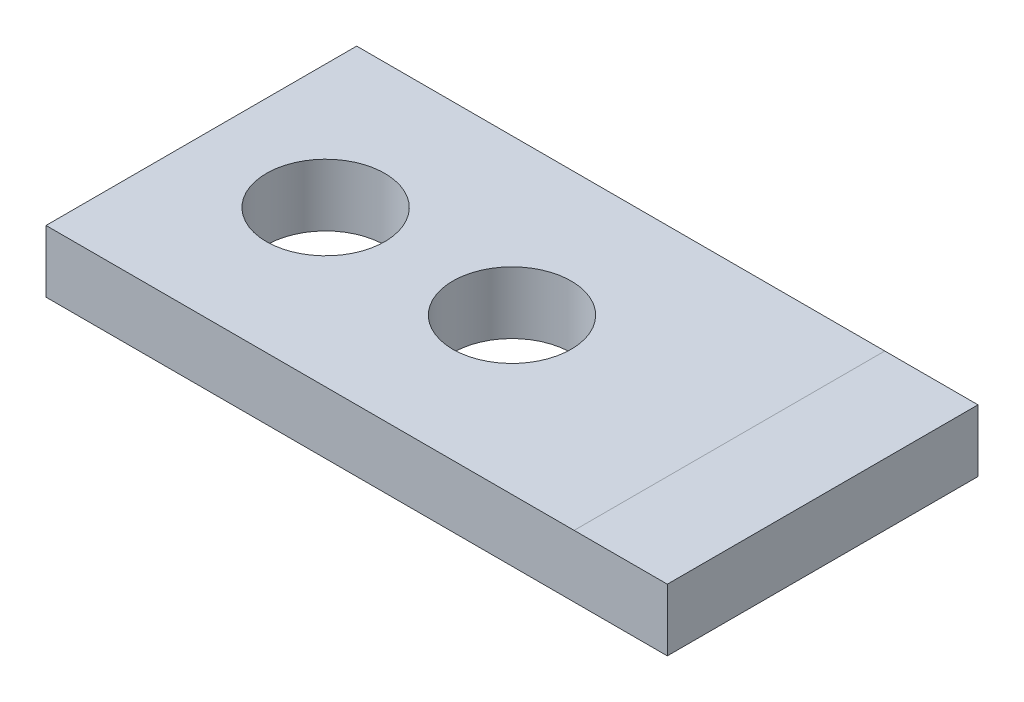
ISO-10303-21;
HEADER;
FILE_DESCRIPTION(('STEP AP214'),'2;1');
FILE_NAME('part.step','',(''),(''),'','','');
FILE_SCHEMA(('AUTOMOTIVE_DESIGN { 1 0 10303 214 1 1 1 1 }'));
ENDSEC;
DATA;
#1=APPLICATION_CONTEXT('core data for automotive mechanical design processes');
#2=APPLICATION_PROTOCOL_DEFINITION('international standard','automotive_design',2000,#1);
#3=PRODUCT_CONTEXT('',#1,'mechanical');
#4=PRODUCT('Part','Part','',(#3));
#5=PRODUCT_RELATED_PRODUCT_CATEGORY('part','',(#4));
#6=PRODUCT_DEFINITION_FORMATION('','',#4);
#7=PRODUCT_DEFINITION_CONTEXT('part definition',#1,'design');
#8=PRODUCT_DEFINITION('design','',#6,#7);
#9=PRODUCT_DEFINITION_SHAPE('','',#8);
#10=(LENGTH_UNIT() NAMED_UNIT(*) SI_UNIT(.MILLI.,.METRE.));
#11=(NAMED_UNIT(*) PLANE_ANGLE_UNIT() SI_UNIT($,.RADIAN.));
#12=(NAMED_UNIT(*) SI_UNIT($,.STERADIAN.) SOLID_ANGLE_UNIT());
#13=UNCERTAINTY_MEASURE_WITH_UNIT(LENGTH_MEASURE(1.E-05),#10,'distance_accuracy_value','');
#14=(GEOMETRIC_REPRESENTATION_CONTEXT(3) GLOBAL_UNCERTAINTY_ASSIGNED_CONTEXT((#13)) GLOBAL_UNIT_ASSIGNED_CONTEXT((#10,
#11,#12)) REPRESENTATION_CONTEXT('',''));
#15=CARTESIAN_POINT('',(0.,0.,0.));
#16=DIRECTION('',(0.,0.,1.));
#17=DIRECTION('',(1.,0.,0.));
#18=AXIS2_PLACEMENT_3D('',#15,#16,#17);
#19=CARTESIAN_POINT('',(0.,0.,0.));
#20=DIRECTION('',(0.,-1.,0.));
#21=DIRECTION('',(0.,0.,-1.));
#22=AXIS2_PLACEMENT_3D('',#19,#20,#21);
#23=PLANE('',#22);
#24=CARTESIAN_POINT('',(50.,0.,-25.));
#25=DIRECTION('',(0.,1.,0.));
#26=DIRECTION('',(0.,0.,1.));
#27=AXIS2_PLACEMENT_3D('',#24,#25,#26);
#28=CIRCLE('',#27,9.52500000000002);
#29=CARTESIAN_POINT('',(50.,0.,-15.475));
#30=VERTEX_POINT('',#29);
#31=EDGE_CURVE('E205',#30,#30,#28,.T.);
#32=ORIENTED_EDGE('',*,*,#31,.T.);
#33=EDGE_LOOP('',(#32));
#34=FACE_BOUND('',#33,.T.);
#35=DIRECTION('',(1.,0.,0.));
#36=VECTOR('',#35,1.);
#37=CARTESIAN_POINT('',(0.,0.,0.));
#38=LINE('',#37,#36);
#39=CARTESIAN_POINT('',(35.,0.,0.));
#40=VERTEX_POINT('',#39);
#41=CARTESIAN_POINT('',(100.,0.,0.));
#42=VERTEX_POINT('',#41);
#43=EDGE_CURVE('E148',#40,#42,#38,.T.);
#44=ORIENTED_EDGE('',*,*,#43,.F.);
#45=DIRECTION('',(0.,0.,-1.));
#46=VECTOR('',#45,1.);
#47=CARTESIAN_POINT('',(35.,0.,0.));
#48=LINE('',#47,#46);
#49=CARTESIAN_POINT('',(35.,0.,-50.));
#50=VERTEX_POINT('',#49);
#51=EDGE_CURVE('E12',#40,#50,#48,.T.);
#52=ORIENTED_EDGE('',*,*,#51,.T.);
#53=DIRECTION('',(-1.,0.,0.));
#54=VECTOR('',#53,1.);
#55=CARTESIAN_POINT('',(0.,0.,-50.));
#56=LINE('',#55,#54);
#57=CARTESIAN_POINT('',(100.,0.,-50.));
#58=VERTEX_POINT('',#57);
#59=EDGE_CURVE('E125',#58,#50,#56,.T.);
#60=ORIENTED_EDGE('',*,*,#59,.F.);
#61=DIRECTION('',(0.,0.,-1.));
#62=VECTOR('',#61,1.);
#63=CARTESIAN_POINT('',(100.,0.,0.));
#64=LINE('',#63,#62);
#65=EDGE_CURVE('E144',#42,#58,#64,.T.);
#66=ORIENTED_EDGE('',*,*,#65,.F.);
#67=EDGE_LOOP('',(#44,#52,#60,#66));
#68=FACE_BOUND('',#67,.T.);
#69=ADVANCED_FACE('F54',(#34,#68),#23,.T.);
#70=CARTESIAN_POINT('',(0.,10.,0.));
#71=DIRECTION('',(0.,-1.,0.));
#72=DIRECTION('',(0.,0.,-1.));
#73=AXIS2_PLACEMENT_3D('',#70,#71,#72);
#74=PLANE('',#73);
#75=CARTESIAN_POINT('',(50.,10.,-25.));
#76=DIRECTION('',(0.,1.,0.));
#77=DIRECTION('',(0.,0.,1.));
#78=AXIS2_PLACEMENT_3D('',#75,#76,#77);
#79=CIRCLE('',#78,9.52500000000002);
#80=CARTESIAN_POINT('',(50.,10.,-15.475));
#81=VERTEX_POINT('',#80);
#82=EDGE_CURVE('E203',#81,#81,#79,.T.);
#83=ORIENTED_EDGE('',*,*,#82,.F.);
#84=EDGE_LOOP('',(#83));
#85=FACE_BOUND('',#84,.T.);
#86=CARTESIAN_POINT('',(20.,10.,-25.));
#87=DIRECTION('',(0.,1.,0.));
#88=DIRECTION('',(0.,0.,1.));
#89=AXIS2_PLACEMENT_3D('',#86,#87,#88);
#90=CIRCLE('',#89,9.525);
#91=CARTESIAN_POINT('',(20.,10.,-15.475));
#92=VERTEX_POINT('',#91);
#93=EDGE_CURVE('E150',#92,#92,#90,.T.);
#94=ORIENTED_EDGE('',*,*,#93,.F.);
#95=EDGE_LOOP('',(#94));
#96=FACE_BOUND('',#95,.T.);
#97=DIRECTION('',(0.,0.,1.));
#98=VECTOR('',#97,1.);
#99=CARTESIAN_POINT('',(85.,10.,0.));
#100=LINE('',#99,#98);
#101=CARTESIAN_POINT('',(85.,10.,-50.));
#102=VERTEX_POINT('',#101);
#103=CARTESIAN_POINT('',(85.,10.,0.));
#104=VERTEX_POINT('',#103);
#105=EDGE_CURVE('E63',#102,#104,#100,.T.);
#106=ORIENTED_EDGE('',*,*,#105,.F.);
#107=DIRECTION('',(-1.,0.,0.));
#108=VECTOR('',#107,1.);
#109=CARTESIAN_POINT('',(0.,10.,-50.));
#110=LINE('',#109,#108);
#111=CARTESIAN_POINT('',(0.,10.,-50.));
#112=VERTEX_POINT('',#111);
#113=EDGE_CURVE('E121',#102,#112,#110,.T.);
#114=ORIENTED_EDGE('',*,*,#113,.T.);
#115=DIRECTION('',(0.,0.,1.));
#116=VECTOR('',#115,1.);
#117=CARTESIAN_POINT('',(0.,10.,0.));
#118=LINE('',#117,#116);
#119=CARTESIAN_POINT('',(0.,10.,0.));
#120=VERTEX_POINT('',#119);
#121=EDGE_CURVE('E118',#112,#120,#118,.T.);
#122=ORIENTED_EDGE('',*,*,#121,.T.);
#123=DIRECTION('',(1.,0.,0.));
#124=VECTOR('',#123,1.);
#125=CARTESIAN_POINT('',(0.,10.,0.));
#126=LINE('',#125,#124);
#127=EDGE_CURVE('E105',#120,#104,#126,.T.);
#128=ORIENTED_EDGE('',*,*,#127,.T.);
#129=EDGE_LOOP('',(#106,#114,#122,#128));
#130=FACE_BOUND('',#129,.T.);
#131=ADVANCED_FACE('F119',(#85,#96,#130),#74,.F.);
#132=CARTESIAN_POINT('',(100.,10.,-50.));
#133=VERTEX_POINT('',#132);
#134=EDGE_CURVE('E140',#133,#102,#110,.T.);
#135=ORIENTED_EDGE('',*,*,#134,.T.);
#136=ORIENTED_EDGE('',*,*,#105,.T.);
#137=CARTESIAN_POINT('',(100.,10.,0.));
#138=VERTEX_POINT('',#137);
#139=EDGE_CURVE('E113',#104,#138,#126,.T.);
#140=ORIENTED_EDGE('',*,*,#139,.T.);
#141=DIRECTION('',(0.,0.,-1.));
#142=VECTOR('',#141,1.);
#143=CARTESIAN_POINT('',(100.,10.,0.));
#144=LINE('',#143,#142);
#145=EDGE_CURVE('E115',#138,#133,#144,.T.);
#146=ORIENTED_EDGE('',*,*,#145,.T.);
#147=EDGE_LOOP('',(#135,#136,#140,#146));
#148=FACE_BOUND('',#147,.T.);
#149=ADVANCED_FACE('F164',(#148),#74,.F.);
#150=ORIENTED_EDGE('',*,*,#51,.F.);
#151=CARTESIAN_POINT('',(0.,0.,0.));
#152=VERTEX_POINT('',#151);
#153=EDGE_CURVE('E146',#152,#40,#38,.T.);
#154=ORIENTED_EDGE('',*,*,#153,.F.);
#155=DIRECTION('',(0.,0.,1.));
#156=VECTOR('',#155,1.);
#157=CARTESIAN_POINT('',(0.,0.,0.));
#158=LINE('',#157,#156);
#159=CARTESIAN_POINT('',(0.,0.,-50.));
#160=VERTEX_POINT('',#159);
#161=EDGE_CURVE('E128',#160,#152,#158,.T.);
#162=ORIENTED_EDGE('',*,*,#161,.F.);
#163=EDGE_CURVE('E143',#50,#160,#56,.T.);
#164=ORIENTED_EDGE('',*,*,#163,.F.);
#165=EDGE_LOOP('',(#150,#154,#162,#164));
#166=FACE_BOUND('',#165,.T.);
#167=CARTESIAN_POINT('',(20.,0.,-25.));
#168=DIRECTION('',(0.,1.,0.));
#169=DIRECTION('',(0.,0.,1.));
#170=AXIS2_PLACEMENT_3D('',#167,#168,#169);
#171=CIRCLE('',#170,9.525);
#172=CARTESIAN_POINT('',(20.,0.,-15.475));
#173=VERTEX_POINT('',#172);
#174=EDGE_CURVE('E158',#173,#173,#171,.T.);
#175=ORIENTED_EDGE('',*,*,#174,.T.);
#176=EDGE_LOOP('',(#175));
#177=FACE_BOUND('',#176,.T.);
#178=ADVANCED_FACE('F167',(#166,#177),#23,.T.);
#179=CARTESIAN_POINT('',(0.,10.,0.));
#180=DIRECTION('',(1.,0.,0.));
#181=DIRECTION('',(0.,0.,-1.));
#182=AXIS2_PLACEMENT_3D('',#179,#180,#181);
#183=PLANE('',#182);
#184=ORIENTED_EDGE('',*,*,#161,.T.);
#185=DIRECTION('',(0.,-1.,0.));
#186=VECTOR('',#185,1.);
#187=CARTESIAN_POINT('',(0.,10.,0.));
#188=LINE('',#187,#186);
#189=EDGE_CURVE('E110',#120,#152,#188,.T.);
#190=ORIENTED_EDGE('',*,*,#189,.F.);
#191=ORIENTED_EDGE('',*,*,#121,.F.);
#192=DIRECTION('',(0.,-1.,0.));
#193=VECTOR('',#192,1.);
#194=CARTESIAN_POINT('',(0.,10.,-50.));
#195=LINE('',#194,#193);
#196=EDGE_CURVE('E138',#112,#160,#195,.T.);
#197=ORIENTED_EDGE('',*,*,#196,.T.);
#198=EDGE_LOOP('',(#184,#190,#191,#197));
#199=FACE_BOUND('',#198,.T.);
#200=ADVANCED_FACE('F56',(#199),#183,.F.);
#201=CARTESIAN_POINT('',(0.,10.,0.));
#202=DIRECTION('',(0.,0.,-1.));
#203=DIRECTION('',(-1.,0.,0.));
#204=AXIS2_PLACEMENT_3D('',#201,#202,#203);
#205=PLANE('',#204);
#206=ORIENTED_EDGE('',*,*,#153,.T.);
#207=ORIENTED_EDGE('',*,*,#43,.T.);
#208=DIRECTION('',(0.,-1.,0.));
#209=VECTOR('',#208,1.);
#210=CARTESIAN_POINT('',(100.,10.,0.));
#211=LINE('',#210,#209);
#212=EDGE_CURVE('E129',#138,#42,#211,.T.);
#213=ORIENTED_EDGE('',*,*,#212,.F.);
#214=ORIENTED_EDGE('',*,*,#139,.F.);
#215=ORIENTED_EDGE('',*,*,#127,.F.);
#216=ORIENTED_EDGE('',*,*,#189,.T.);
#217=EDGE_LOOP('',(#206,#207,#213,#214,#215,#216));
#218=FACE_BOUND('',#217,.T.);
#219=ADVANCED_FACE('F108',(#218),#205,.F.);
#220=CARTESIAN_POINT('',(100.,10.,0.));
#221=DIRECTION('',(-1.,0.,0.));
#222=DIRECTION('',(0.,0.,1.));
#223=AXIS2_PLACEMENT_3D('',#220,#221,#222);
#224=PLANE('',#223);
#225=ORIENTED_EDGE('',*,*,#65,.T.);
#226=DIRECTION('',(0.,-1.,0.));
#227=VECTOR('',#226,1.);
#228=CARTESIAN_POINT('',(100.,10.,-50.));
#229=LINE('',#228,#227);
#230=EDGE_CURVE('E133',#133,#58,#229,.T.);
#231=ORIENTED_EDGE('',*,*,#230,.F.);
#232=ORIENTED_EDGE('',*,*,#145,.F.);
#233=ORIENTED_EDGE('',*,*,#212,.T.);
#234=EDGE_LOOP('',(#225,#231,#232,#233));
#235=FACE_BOUND('',#234,.T.);
#236=ADVANCED_FACE('F171',(#235),#224,.F.);
#237=CARTESIAN_POINT('',(0.,10.,-50.));
#238=DIRECTION('',(0.,0.,1.));
#239=DIRECTION('',(1.,0.,0.));
#240=AXIS2_PLACEMENT_3D('',#237,#238,#239);
#241=PLANE('',#240);
#242=ORIENTED_EDGE('',*,*,#59,.T.);
#243=ORIENTED_EDGE('',*,*,#163,.T.);
#244=ORIENTED_EDGE('',*,*,#196,.F.);
#245=ORIENTED_EDGE('',*,*,#113,.F.);
#246=ORIENTED_EDGE('',*,*,#134,.F.);
#247=ORIENTED_EDGE('',*,*,#230,.T.);
#248=EDGE_LOOP('',(#242,#243,#244,#245,#246,#247));
#249=FACE_BOUND('',#248,.T.);
#250=ADVANCED_FACE('F166',(#249),#241,.F.);
#251=CARTESIAN_POINT('',(20.,10.,-25.));
#252=DIRECTION('',(0.,-1.,0.));
#253=DIRECTION('',(0.,0.,-1.));
#254=AXIS2_PLACEMENT_3D('',#251,#252,#253);
#255=CYLINDRICAL_SURFACE('',#254,9.525);
#256=ORIENTED_EDGE('',*,*,#93,.T.);
#257=EDGE_LOOP('',(#256));
#258=FACE_BOUND('',#257,.T.);
#259=ORIENTED_EDGE('',*,*,#174,.F.);
#260=EDGE_LOOP('',(#259));
#261=FACE_BOUND('',#260,.T.);
#262=ADVANCED_FACE('F191',(#258,#261),#255,.F.);
#263=CARTESIAN_POINT('',(50.,10.,-25.));
#264=DIRECTION('',(0.,-1.,0.));
#265=DIRECTION('',(0.,0.,-1.));
#266=AXIS2_PLACEMENT_3D('',#263,#264,#265);
#267=CYLINDRICAL_SURFACE('',#266,9.52500000000002);
#268=ORIENTED_EDGE('',*,*,#82,.T.);
#269=EDGE_LOOP('',(#268));
#270=FACE_BOUND('',#269,.T.);
#271=ORIENTED_EDGE('',*,*,#31,.F.);
#272=EDGE_LOOP('',(#271));
#273=FACE_BOUND('',#272,.T.);
#274=ADVANCED_FACE('F194',(#270,#273),#267,.F.);
#275=CLOSED_SHELL('',(#69,#131,#149,#178,#200,#219,#236,#250,#262,#274));
#276=MANIFOLD_SOLID_BREP('B2',#275);
#277=ADVANCED_BREP_SHAPE_REPRESENTATION('',(#18,#276),#14);
#278=SHAPE_DEFINITION_REPRESENTATION(#9,#277);
ENDSEC;
END-ISO-10303-21;
